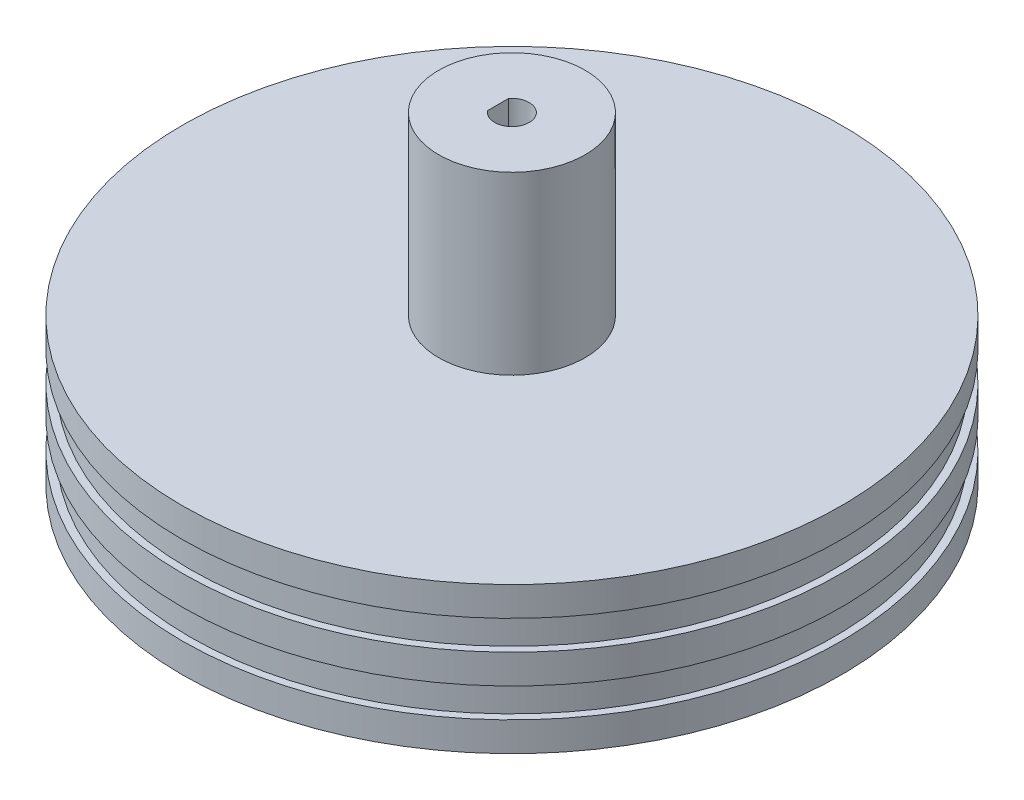
ISO-10303-21;
HEADER;
FILE_DESCRIPTION(('STEP AP214'),'2;1');
FILE_NAME('part.step','',(''),(''),'','','');
FILE_SCHEMA(('AUTOMOTIVE_DESIGN { 1 0 10303 214 1 1 1 1 }'));
ENDSEC;
DATA;
#1=APPLICATION_CONTEXT('core data for automotive mechanical design processes');
#2=APPLICATION_PROTOCOL_DEFINITION('international standard','automotive_design',2000,#1);
#3=PRODUCT_CONTEXT('',#1,'mechanical');
#4=PRODUCT('Part','Part','',(#3));
#5=PRODUCT_RELATED_PRODUCT_CATEGORY('part','',(#4));
#6=PRODUCT_DEFINITION_FORMATION('','',#4);
#7=PRODUCT_DEFINITION_CONTEXT('part definition',#1,'design');
#8=PRODUCT_DEFINITION('design','',#6,#7);
#9=PRODUCT_DEFINITION_SHAPE('','',#8);
#10=(LENGTH_UNIT() NAMED_UNIT(*) SI_UNIT(.MILLI.,.METRE.));
#11=(NAMED_UNIT(*) PLANE_ANGLE_UNIT() SI_UNIT($,.RADIAN.));
#12=(NAMED_UNIT(*) SI_UNIT($,.STERADIAN.) SOLID_ANGLE_UNIT());
#13=UNCERTAINTY_MEASURE_WITH_UNIT(LENGTH_MEASURE(1.E-05),#10,'distance_accuracy_value','');
#14=(GEOMETRIC_REPRESENTATION_CONTEXT(3) GLOBAL_UNCERTAINTY_ASSIGNED_CONTEXT((#13)) GLOBAL_UNIT_ASSIGNED_CONTEXT((#10,
#11,#12)) REPRESENTATION_CONTEXT('',''));
#15=CARTESIAN_POINT('',(0.,0.,0.));
#16=DIRECTION('',(0.,0.,1.));
#17=DIRECTION('',(1.,0.,0.));
#18=AXIS2_PLACEMENT_3D('',#15,#16,#17);
#19=CARTESIAN_POINT('',(0.,2.54,0.));
#20=DIRECTION('',(0.,-1.,0.));
#21=DIRECTION('',(0.,0.,-1.));
#22=AXIS2_PLACEMENT_3D('',#19,#20,#21);
#23=CYLINDRICAL_SURFACE('',#22,28.575);
#24=CARTESIAN_POINT('',(0.,2.54,0.));
#25=DIRECTION('',(0.,1.,0.));
#26=DIRECTION('',(0.,0.,1.));
#27=AXIS2_PLACEMENT_3D('',#24,#25,#26);
#28=CIRCLE('',#27,28.575);
#29=CARTESIAN_POINT('',(0.,2.54,28.575));
#30=VERTEX_POINT('',#29);
#31=EDGE_CURVE('E106',#30,#30,#28,.T.);
#32=ORIENTED_EDGE('',*,*,#31,.F.);
#33=EDGE_LOOP('',(#32));
#34=FACE_BOUND('',#33,.T.);
#35=CARTESIAN_POINT('',(0.,0.,0.));
#36=DIRECTION('',(0.,1.,0.));
#37=DIRECTION('',(0.,0.,1.));
#38=AXIS2_PLACEMENT_3D('',#35,#36,#37);
#39=CIRCLE('',#38,28.575);
#40=CARTESIAN_POINT('',(0.,0.,28.575));
#41=VERTEX_POINT('',#40);
#42=EDGE_CURVE('E37',#41,#41,#39,.T.);
#43=ORIENTED_EDGE('',*,*,#42,.T.);
#44=EDGE_LOOP('',(#43));
#45=FACE_BOUND('',#44,.T.);
#46=ADVANCED_FACE('F34',(#34,#45),#23,.T.);
#47=CARTESIAN_POINT('',(0.,2.54,0.));
#48=DIRECTION('',(0.,1.,0.));
#49=DIRECTION('',(0.,0.,1.));
#50=AXIS2_PLACEMENT_3D('',#47,#48,#49);
#51=PLANE('',#50);
#52=CARTESIAN_POINT('',(0.,2.54,0.));
#53=DIRECTION('',(0.,1.,0.));
#54=DIRECTION('',(0.,0.,1.));
#55=AXIS2_PLACEMENT_3D('',#52,#53,#54);
#56=CIRCLE('',#55,27.94);
#57=CARTESIAN_POINT('',(0.,2.54,27.94));
#58=VERTEX_POINT('',#57);
#59=EDGE_CURVE('E96',#58,#58,#56,.T.);
#60=ORIENTED_EDGE('',*,*,#59,.F.);
#61=EDGE_LOOP('',(#60));
#62=FACE_BOUND('',#61,.T.);
#63=ORIENTED_EDGE('',*,*,#31,.T.);
#64=EDGE_LOOP('',(#63));
#65=FACE_BOUND('',#64,.T.);
#66=ADVANCED_FACE('F117',(#62,#65),#51,.T.);
#67=CARTESIAN_POINT('',(0.,0.,0.));
#68=DIRECTION('',(0.,1.,0.));
#69=DIRECTION('',(0.,0.,1.));
#70=AXIS2_PLACEMENT_3D('',#67,#68,#69);
#71=PLANE('',#70);
#72=ORIENTED_EDGE('',*,*,#42,.F.);
#73=EDGE_LOOP('',(#72));
#74=FACE_BOUND('',#73,.T.);
#75=ADVANCED_FACE('F114',(#74),#71,.F.);
#76=CARTESIAN_POINT('',(0.,5.08,0.));
#77=DIRECTION('',(0.,-1.,0.));
#78=DIRECTION('',(0.,0.,-1.));
#79=AXIS2_PLACEMENT_3D('',#76,#77,#78);
#80=CYLINDRICAL_SURFACE('',#79,27.94);
#81=CARTESIAN_POINT('',(0.,5.08,0.));
#82=DIRECTION('',(0.,1.,0.));
#83=DIRECTION('',(0.,0.,1.));
#84=AXIS2_PLACEMENT_3D('',#81,#82,#83);
#85=CIRCLE('',#84,27.94);
#86=CARTESIAN_POINT('',(0.,5.08,27.94));
#87=VERTEX_POINT('',#86);
#88=EDGE_CURVE('E100',#87,#87,#85,.T.);
#89=ORIENTED_EDGE('',*,*,#88,.F.);
#90=EDGE_LOOP('',(#89));
#91=FACE_BOUND('',#90,.T.);
#92=ORIENTED_EDGE('',*,*,#59,.T.);
#93=EDGE_LOOP('',(#92));
#94=FACE_BOUND('',#93,.T.);
#95=ADVANCED_FACE('F116',(#91,#94),#80,.T.);
#96=CARTESIAN_POINT('',(0.,7.62,0.));
#97=DIRECTION('',(0.,-1.,0.));
#98=DIRECTION('',(0.,0.,-1.));
#99=AXIS2_PLACEMENT_3D('',#96,#97,#98);
#100=CYLINDRICAL_SURFACE('',#99,28.575);
#101=CARTESIAN_POINT('',(0.,7.62,0.));
#102=DIRECTION('',(0.,1.,0.));
#103=DIRECTION('',(0.,0.,1.));
#104=AXIS2_PLACEMENT_3D('',#101,#102,#103);
#105=CIRCLE('',#104,28.575);
#106=CARTESIAN_POINT('',(0.,7.62,28.575));
#107=VERTEX_POINT('',#106);
#108=EDGE_CURVE('E97',#107,#107,#105,.T.);
#109=ORIENTED_EDGE('',*,*,#108,.F.);
#110=EDGE_LOOP('',(#109));
#111=FACE_BOUND('',#110,.T.);
#112=CARTESIAN_POINT('',(0.,5.08,0.));
#113=DIRECTION('',(0.,1.,0.));
#114=DIRECTION('',(0.,0.,1.));
#115=AXIS2_PLACEMENT_3D('',#112,#113,#114);
#116=CIRCLE('',#115,28.575);
#117=CARTESIAN_POINT('',(0.,5.08,28.575));
#118=VERTEX_POINT('',#117);
#119=EDGE_CURVE('E93',#118,#118,#116,.T.);
#120=ORIENTED_EDGE('',*,*,#119,.T.);
#121=EDGE_LOOP('',(#120));
#122=FACE_BOUND('',#121,.T.);
#123=ADVANCED_FACE('F122',(#111,#122),#100,.T.);
#124=CARTESIAN_POINT('',(0.,7.62,0.));
#125=DIRECTION('',(0.,1.,0.));
#126=DIRECTION('',(0.,0.,1.));
#127=AXIS2_PLACEMENT_3D('',#124,#125,#126);
#128=PLANE('',#127);
#129=CARTESIAN_POINT('',(0.,7.62,0.));
#130=DIRECTION('',(0.,1.,0.));
#131=DIRECTION('',(0.,0.,1.));
#132=AXIS2_PLACEMENT_3D('',#129,#130,#131);
#133=CIRCLE('',#132,27.94);
#134=CARTESIAN_POINT('',(0.,7.62,27.94));
#135=VERTEX_POINT('',#134);
#136=EDGE_CURVE('E42',#135,#135,#133,.T.);
#137=ORIENTED_EDGE('',*,*,#136,.F.);
#138=EDGE_LOOP('',(#137));
#139=FACE_BOUND('',#138,.T.);
#140=ORIENTED_EDGE('',*,*,#108,.T.);
#141=EDGE_LOOP('',(#140));
#142=FACE_BOUND('',#141,.T.);
#143=ADVANCED_FACE('F152',(#139,#142),#128,.T.);
#144=CARTESIAN_POINT('',(0.,5.08,0.));
#145=DIRECTION('',(0.,1.,0.));
#146=DIRECTION('',(0.,0.,1.));
#147=AXIS2_PLACEMENT_3D('',#144,#145,#146);
#148=PLANE('',#147);
#149=ORIENTED_EDGE('',*,*,#88,.T.);
#150=EDGE_LOOP('',(#149));
#151=FACE_BOUND('',#150,.T.);
#152=ORIENTED_EDGE('',*,*,#119,.F.);
#153=EDGE_LOOP('',(#152));
#154=FACE_BOUND('',#153,.T.);
#155=ADVANCED_FACE('F160',(#151,#154),#148,.F.);
#156=CARTESIAN_POINT('',(0.,10.16,0.));
#157=DIRECTION('',(0.,-1.,0.));
#158=DIRECTION('',(0.,0.,-1.));
#159=AXIS2_PLACEMENT_3D('',#156,#157,#158);
#160=CYLINDRICAL_SURFACE('',#159,27.94);
#161=CARTESIAN_POINT('',(0.,10.16,0.));
#162=DIRECTION('',(0.,1.,0.));
#163=DIRECTION('',(0.,0.,1.));
#164=AXIS2_PLACEMENT_3D('',#161,#162,#163);
#165=CIRCLE('',#164,27.94);
#166=CARTESIAN_POINT('',(0.,10.16,27.94));
#167=VERTEX_POINT('',#166);
#168=EDGE_CURVE('E88',#167,#167,#165,.T.);
#169=ORIENTED_EDGE('',*,*,#168,.F.);
#170=EDGE_LOOP('',(#169));
#171=FACE_BOUND('',#170,.T.);
#172=ORIENTED_EDGE('',*,*,#136,.T.);
#173=EDGE_LOOP('',(#172));
#174=FACE_BOUND('',#173,.T.);
#175=ADVANCED_FACE('F165',(#171,#174),#160,.T.);
#176=CARTESIAN_POINT('',(0.,12.7,0.));
#177=DIRECTION('',(0.,-1.,0.));
#178=DIRECTION('',(0.,0.,-1.));
#179=AXIS2_PLACEMENT_3D('',#176,#177,#178);
#180=CYLINDRICAL_SURFACE('',#179,28.575);
#181=CARTESIAN_POINT('',(0.,12.7,0.));
#182=DIRECTION('',(0.,1.,0.));
#183=DIRECTION('',(0.,0.,1.));
#184=AXIS2_PLACEMENT_3D('',#181,#182,#183);
#185=CIRCLE('',#184,28.575);
#186=CARTESIAN_POINT('',(0.,12.7,28.575));
#187=VERTEX_POINT('',#186);
#188=EDGE_CURVE('E85',#187,#187,#185,.T.);
#189=ORIENTED_EDGE('',*,*,#188,.F.);
#190=EDGE_LOOP('',(#189));
#191=FACE_BOUND('',#190,.T.);
#192=CARTESIAN_POINT('',(0.,10.16,0.));
#193=DIRECTION('',(0.,1.,0.));
#194=DIRECTION('',(0.,0.,1.));
#195=AXIS2_PLACEMENT_3D('',#192,#193,#194);
#196=CIRCLE('',#195,28.575);
#197=CARTESIAN_POINT('',(0.,10.16,28.575));
#198=VERTEX_POINT('',#197);
#199=EDGE_CURVE('E83',#198,#198,#196,.T.);
#200=ORIENTED_EDGE('',*,*,#199,.T.);
#201=EDGE_LOOP('',(#200));
#202=FACE_BOUND('',#201,.T.);
#203=ADVANCED_FACE('F182',(#191,#202),#180,.T.);
#204=CARTESIAN_POINT('',(0.,12.7,0.));
#205=DIRECTION('',(0.,1.,0.));
#206=DIRECTION('',(0.,0.,1.));
#207=AXIS2_PLACEMENT_3D('',#204,#205,#206);
#208=PLANE('',#207);
#209=CARTESIAN_POINT('',(0.,12.7,0.));
#210=DIRECTION('',(0.,1.,0.));
#211=DIRECTION('',(0.,0.,1.));
#212=AXIS2_PLACEMENT_3D('',#209,#210,#211);
#213=CIRCLE('',#212,6.34999999999997);
#214=CARTESIAN_POINT('',(0.,12.7,-6.34999999999997));
#215=VERTEX_POINT('',#214);
#216=EDGE_CURVE('E11',#215,#215,#213,.T.);
#217=ORIENTED_EDGE('',*,*,#216,.F.);
#218=EDGE_LOOP('',(#217));
#219=FACE_BOUND('',#218,.T.);
#220=ORIENTED_EDGE('',*,*,#188,.T.);
#221=EDGE_LOOP('',(#220));
#222=FACE_BOUND('',#221,.T.);
#223=ADVANCED_FACE('F192',(#219,#222),#208,.T.);
#224=CARTESIAN_POINT('',(0.,10.16,0.));
#225=DIRECTION('',(0.,1.,0.));
#226=DIRECTION('',(0.,0.,1.));
#227=AXIS2_PLACEMENT_3D('',#224,#225,#226);
#228=PLANE('',#227);
#229=ORIENTED_EDGE('',*,*,#168,.T.);
#230=EDGE_LOOP('',(#229));
#231=FACE_BOUND('',#230,.T.);
#232=ORIENTED_EDGE('',*,*,#199,.F.);
#233=EDGE_LOOP('',(#232));
#234=FACE_BOUND('',#233,.T.);
#235=ADVANCED_FACE('F200',(#231,#234),#228,.F.);
#236=CARTESIAN_POINT('',(0.,27.94,0.));
#237=DIRECTION('',(0.,-1.,0.));
#238=DIRECTION('',(0.,0.,-1.));
#239=AXIS2_PLACEMENT_3D('',#236,#237,#238);
#240=CYLINDRICAL_SURFACE('',#239,6.34999999999997);
#241=CARTESIAN_POINT('',(0.,27.94,0.));
#242=DIRECTION('',(0.,1.,0.));
#243=DIRECTION('',(0.,0.,1.));
#244=AXIS2_PLACEMENT_3D('',#241,#242,#243);
#245=CIRCLE('',#244,6.34999999999997);
#246=CARTESIAN_POINT('',(0.,27.94,-6.34999999999997));
#247=VERTEX_POINT('',#246);
#248=EDGE_CURVE('E66',#247,#247,#245,.T.);
#249=CARTESIAN_POINT('',(0.,27.94,-6.34999999999997));
#250=CARTESIAN_POINT('',(0.,27.78125,-6.34999999999997));
#251=CARTESIAN_POINT('',(0.,27.6225,-6.34999999999997));
#252=CARTESIAN_POINT('',(0.,27.305,-6.34999999999997));
#253=CARTESIAN_POINT('',(0.,27.14625,-6.34999999999997));
#254=CARTESIAN_POINT('',(0.,26.82875,-6.34999999999997));
#255=CARTESIAN_POINT('',(0.,26.67,-6.34999999999997));
#256=CARTESIAN_POINT('',(0.,26.3525,-6.34999999999997));
#257=CARTESIAN_POINT('',(0.,26.19375,-6.34999999999997));
#258=CARTESIAN_POINT('',(0.,25.87625,-6.34999999999997));
#259=CARTESIAN_POINT('',(0.,25.7175,-6.34999999999997));
#260=CARTESIAN_POINT('',(0.,25.4,-6.34999999999997));
#261=CARTESIAN_POINT('',(0.,25.24125,-6.34999999999997));
#262=CARTESIAN_POINT('',(0.,24.92375,-6.34999999999997));
#263=CARTESIAN_POINT('',(0.,24.765,-6.34999999999997));
#264=CARTESIAN_POINT('',(0.,24.4475,-6.34999999999997));
#265=CARTESIAN_POINT('',(0.,24.28875,-6.34999999999997));
#266=CARTESIAN_POINT('',(0.,23.97125,-6.34999999999997));
#267=CARTESIAN_POINT('',(0.,23.8125,-6.34999999999997));
#268=CARTESIAN_POINT('',(0.,23.495,-6.34999999999997));
#269=CARTESIAN_POINT('',(0.,23.33625,-6.34999999999997));
#270=CARTESIAN_POINT('',(0.,23.01875,-6.34999999999997));
#271=CARTESIAN_POINT('',(0.,22.86,-6.34999999999997));
#272=CARTESIAN_POINT('',(0.,22.5425,-6.34999999999997));
#273=CARTESIAN_POINT('',(0.,22.38375,-6.34999999999997));
#274=CARTESIAN_POINT('',(0.,22.06625,-6.34999999999997));
#275=CARTESIAN_POINT('',(0.,21.9075,-6.34999999999997));
#276=CARTESIAN_POINT('',(0.,21.59,-6.34999999999997));
#277=CARTESIAN_POINT('',(0.,21.43125,-6.34999999999997));
#278=CARTESIAN_POINT('',(0.,21.11375,-6.34999999999997));
#279=CARTESIAN_POINT('',(0.,20.955,-6.34999999999997));
#280=CARTESIAN_POINT('',(0.,20.6375,-6.34999999999997));
#281=CARTESIAN_POINT('',(0.,20.47875,-6.34999999999997));
#282=CARTESIAN_POINT('',(0.,20.16125,-6.34999999999997));
#283=CARTESIAN_POINT('',(0.,20.0025,-6.34999999999997));
#284=CARTESIAN_POINT('',(0.,19.685,-6.34999999999997));
#285=CARTESIAN_POINT('',(0.,19.52625,-6.34999999999997));
#286=CARTESIAN_POINT('',(0.,19.20875,-6.34999999999997));
#287=CARTESIAN_POINT('',(0.,19.05,-6.34999999999997));
#288=CARTESIAN_POINT('',(0.,18.7325,-6.34999999999997));
#289=CARTESIAN_POINT('',(0.,18.57375,-6.34999999999997));
#290=CARTESIAN_POINT('',(0.,18.25625,-6.34999999999997));
#291=CARTESIAN_POINT('',(0.,18.0975,-6.34999999999997));
#292=CARTESIAN_POINT('',(0.,17.78,-6.34999999999997));
#293=CARTESIAN_POINT('',(0.,17.62125,-6.34999999999997));
#294=CARTESIAN_POINT('',(0.,17.30375,-6.34999999999997));
#295=CARTESIAN_POINT('',(0.,17.145,-6.34999999999997));
#296=CARTESIAN_POINT('',(0.,16.8275,-6.34999999999997));
#297=CARTESIAN_POINT('',(0.,16.66875,-6.34999999999997));
#298=CARTESIAN_POINT('',(0.,16.35125,-6.34999999999997));
#299=CARTESIAN_POINT('',(0.,16.1925,-6.34999999999997));
#300=CARTESIAN_POINT('',(0.,15.875,-6.34999999999997));
#301=CARTESIAN_POINT('',(0.,15.71625,-6.34999999999997));
#302=CARTESIAN_POINT('',(0.,15.39875,-6.34999999999997));
#303=CARTESIAN_POINT('',(0.,15.24,-6.34999999999997));
#304=CARTESIAN_POINT('',(0.,14.9225,-6.34999999999997));
#305=CARTESIAN_POINT('',(0.,14.76375,-6.34999999999997));
#306=CARTESIAN_POINT('',(0.,14.44625,-6.34999999999997));
#307=CARTESIAN_POINT('',(0.,14.2875,-6.34999999999997));
#308=CARTESIAN_POINT('',(0.,13.97,-6.34999999999997));
#309=CARTESIAN_POINT('',(0.,13.81125,-6.34999999999997));
#310=CARTESIAN_POINT('',(0.,13.49375,-6.34999999999997));
#311=CARTESIAN_POINT('',(0.,13.335,-6.34999999999997));
#312=CARTESIAN_POINT('',(0.,13.0175,-6.34999999999997));
#313=CARTESIAN_POINT('',(0.,12.85875,-6.34999999999997));
#314=CARTESIAN_POINT('',(0.,12.7,-6.34999999999997));
#315=B_SPLINE_CURVE_WITH_KNOTS('',3,(#249,#250,#251,#252,#253,#254,#255,#256,#257,#258,#259,
#260,#261,#262,#263,#264,#265,#266,#267,#268,#269,#270,#271,#272,#273,#274,#275,#276,#277,#278,
#279,#280,#281,#282,#283,#284,#285,#286,#287,#288,#289,#290,#291,#292,#293,#294,#295,#296,#297,
#298,#299,#300,#301,#302,#303,#304,#305,#306,#307,#308,#309,#310,#311,#312,#313,#314),
.UNSPECIFIED.,.F.,.F.,(4,2,2,2,2,2,2,2,2,2,2,2,2,2,2,2,2,2,2,2,2,2,2,2,2,2,2,2,2,2,2,2,4),(0.,
0.476250000000001,0.952500000000002,1.42875,1.905,2.38125,2.8575,3.33375,3.81,4.28625,4.7625,
5.23875,5.715,6.19125,6.6675,7.14375,7.62,8.09625,8.5725,9.04875,9.525,10.00125,10.4775,
10.95375,11.43,11.90625,12.3825,12.85875,13.335,13.81125,14.2875,14.76375,15.24),.UNSPECIFIED.);
#316=EDGE_CURVE('BSEAM205',#247,#215,#315,.T.);
#317=ORIENTED_EDGE('',*,*,#248,.F.);
#318=ORIENTED_EDGE('',*,*,#216,.T.);
#319=ORIENTED_EDGE('',*,*,#316,.T.);
#320=ORIENTED_EDGE('',*,*,#316,.F.);
#321=EDGE_LOOP('',(#317,#319,#318,#320));
#322=FACE_BOUND('',#321,.T.);
#323=ADVANCED_FACE('F205',(#322),#240,.T.);
#324=CARTESIAN_POINT('',(0.,27.94,0.));
#325=DIRECTION('',(0.,1.,0.));
#326=DIRECTION('',(0.,0.,1.));
#327=AXIS2_PLACEMENT_3D('',#324,#325,#326);
#328=PLANE('',#327);
#329=CARTESIAN_POINT('',(0.,27.94,0.));
#330=DIRECTION('',(0.,1.,0.));
#331=DIRECTION('',(0.,0.,1.));
#332=AXIS2_PLACEMENT_3D('',#329,#330,#331);
#333=CIRCLE('',#332,1.500000048);
#334=CARTESIAN_POINT('',(-1.2000000765,27.94,0.899999978));
#335=VERTEX_POINT('',#334);
#336=CARTESIAN_POINT('',(-1.2000000765,27.94,-0.899999978));
#337=VERTEX_POINT('',#336);
#338=EDGE_CURVE('E50',#335,#337,#333,.T.);
#339=ORIENTED_EDGE('',*,*,#338,.F.);
#340=DIRECTION('',(0.,0.,1.));
#341=VECTOR('',#340,1.);
#342=CARTESIAN_POINT('',(-1.2000000765,27.94,-0.899999978));
#343=LINE('',#342,#341);
#344=EDGE_CURVE('E70',#337,#335,#343,.T.);
#345=ORIENTED_EDGE('',*,*,#344,.F.);
#346=EDGE_LOOP('',(#339,#345));
#347=FACE_BOUND('',#346,.T.);
#348=ORIENTED_EDGE('',*,*,#248,.T.);
#349=EDGE_LOOP('',(#348));
#350=FACE_BOUND('',#349,.T.);
#351=ADVANCED_FACE('F74',(#347,#350),#328,.T.);
#352=CARTESIAN_POINT('',(0.,15.24,0.));
#353=DIRECTION('',(0.,1.,0.));
#354=DIRECTION('',(0.,0.,1.));
#355=AXIS2_PLACEMENT_3D('',#352,#353,#354);
#356=CYLINDRICAL_SURFACE('',#355,1.500000048);
#357=ORIENTED_EDGE('',*,*,#338,.T.);
#358=DIRECTION('',(0.,1.,0.));
#359=VECTOR('',#358,1.);
#360=CARTESIAN_POINT('',(-1.2000000765,15.24,-0.899999978));
#361=LINE('',#360,#359);
#362=CARTESIAN_POINT('',(-1.2000000765,15.24,-0.899999978));
#363=VERTEX_POINT('',#362);
#364=EDGE_CURVE('E67',#363,#337,#361,.T.);
#365=ORIENTED_EDGE('',*,*,#364,.F.);
#366=CARTESIAN_POINT('',(0.,15.24,0.));
#367=DIRECTION('',(0.,1.,0.));
#368=DIRECTION('',(0.,0.,1.));
#369=AXIS2_PLACEMENT_3D('',#366,#367,#368);
#370=CIRCLE('',#369,1.500000048);
#371=CARTESIAN_POINT('',(-1.2000000765,15.24,0.899999978));
#372=VERTEX_POINT('',#371);
#373=EDGE_CURVE('E64',#372,#363,#370,.T.);
#374=ORIENTED_EDGE('',*,*,#373,.F.);
#375=DIRECTION('',(0.,1.,0.));
#376=VECTOR('',#375,1.);
#377=CARTESIAN_POINT('',(-1.2000000765,15.24,0.899999978));
#378=LINE('',#377,#376);
#379=EDGE_CURVE('E58',#372,#335,#378,.T.);
#380=ORIENTED_EDGE('',*,*,#379,.T.);
#381=EDGE_LOOP('',(#357,#365,#374,#380));
#382=FACE_BOUND('',#381,.T.);
#383=ADVANCED_FACE('F62',(#382),#356,.F.);
#384=CARTESIAN_POINT('',(-1.2000000765,15.24,-0.899999978));
#385=DIRECTION('',(-1.,0.,0.));
#386=DIRECTION('',(0.,0.,1.));
#387=AXIS2_PLACEMENT_3D('',#384,#385,#386);
#388=PLANE('',#387);
#389=ORIENTED_EDGE('',*,*,#344,.T.);
#390=ORIENTED_EDGE('',*,*,#379,.F.);
#391=DIRECTION('',(0.,0.,1.));
#392=VECTOR('',#391,1.);
#393=CARTESIAN_POINT('',(-1.2000000765,15.24,-0.899999978));
#394=LINE('',#393,#392);
#395=EDGE_CURVE('E78',#363,#372,#394,.T.);
#396=ORIENTED_EDGE('',*,*,#395,.F.);
#397=ORIENTED_EDGE('',*,*,#364,.T.);
#398=EDGE_LOOP('',(#389,#390,#396,#397));
#399=FACE_BOUND('',#398,.T.);
#400=ADVANCED_FACE('F71',(#399),#388,.F.);
#401=CARTESIAN_POINT('',(0.,15.24,0.));
#402=DIRECTION('',(0.,1.,0.));
#403=DIRECTION('',(0.,0.,1.));
#404=AXIS2_PLACEMENT_3D('',#401,#402,#403);
#405=PLANE('',#404);
#406=ORIENTED_EDGE('',*,*,#373,.T.);
#407=ORIENTED_EDGE('',*,*,#395,.T.);
#408=EDGE_LOOP('',(#406,#407));
#409=FACE_BOUND('',#408,.T.);
#410=ADVANCED_FACE('F247',(#409),#405,.T.);
#411=CLOSED_SHELL('',(#46,#66,#75,#95,#123,#143,#155,#175,#203,#223,#235,#323,#351,#383,#400,#410));
#412=MANIFOLD_SOLID_BREP('B2',#411);
#413=ADVANCED_BREP_SHAPE_REPRESENTATION('',(#18,#412),#14);
#414=SHAPE_DEFINITION_REPRESENTATION(#9,#413);
ENDSEC;
END-ISO-10303-21;
